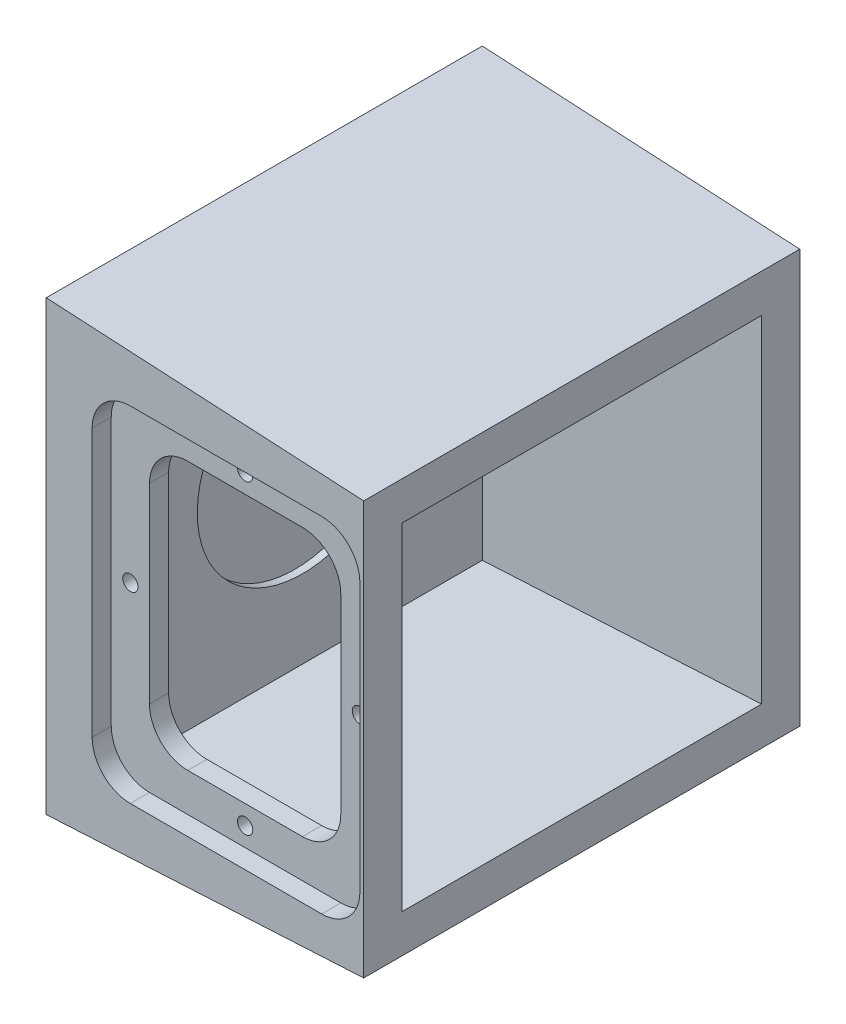
ISO-10303-21;
HEADER;
FILE_DESCRIPTION(('STEP AP214'),'2;1');
FILE_NAME('part.step','',(''),(''),'','','');
FILE_SCHEMA(('AUTOMOTIVE_DESIGN { 1 0 10303 214 1 1 1 1 }'));
ENDSEC;
DATA;
#1=APPLICATION_CONTEXT('core data for automotive mechanical design processes');
#2=APPLICATION_PROTOCOL_DEFINITION('international standard','automotive_design',2000,#1);
#3=PRODUCT_CONTEXT('',#1,'mechanical');
#4=PRODUCT('Part','Part','',(#3));
#5=PRODUCT_RELATED_PRODUCT_CATEGORY('part','',(#4));
#6=PRODUCT_DEFINITION_FORMATION('','',#4);
#7=PRODUCT_DEFINITION_CONTEXT('part definition',#1,'design');
#8=PRODUCT_DEFINITION('design','',#6,#7);
#9=PRODUCT_DEFINITION_SHAPE('','',#8);
#10=(LENGTH_UNIT() NAMED_UNIT(*) SI_UNIT(.MILLI.,.METRE.));
#11=(NAMED_UNIT(*) PLANE_ANGLE_UNIT() SI_UNIT($,.RADIAN.));
#12=(NAMED_UNIT(*) SI_UNIT($,.STERADIAN.) SOLID_ANGLE_UNIT());
#13=UNCERTAINTY_MEASURE_WITH_UNIT(LENGTH_MEASURE(1.E-05),#10,'distance_accuracy_value','');
#14=(GEOMETRIC_REPRESENTATION_CONTEXT(3) GLOBAL_UNCERTAINTY_ASSIGNED_CONTEXT((#13)) GLOBAL_UNIT_ASSIGNED_CONTEXT((#10,
#11,#12)) REPRESENTATION_CONTEXT('',''));
#15=CARTESIAN_POINT('',(0.,0.,0.));
#16=DIRECTION('',(0.,0.,1.));
#17=DIRECTION('',(1.,0.,0.));
#18=AXIS2_PLACEMENT_3D('',#15,#16,#17);
#19=CARTESIAN_POINT('',(-74.,0.,0.));
#20=DIRECTION('',(-1.,0.,0.));
#21=DIRECTION('',(0.,0.,1.));
#22=AXIS2_PLACEMENT_3D('',#19,#20,#21);
#23=PLANE('',#22);
#24=DIRECTION('',(0.,-1.,0.));
#25=VECTOR('',#24,1.);
#26=CARTESIAN_POINT('',(-74.,0.,-47.));
#27=LINE('',#26,#25);
#28=CARTESIAN_POINT('',(-74.,43.9917243836477,-47.));
#29=VERTEX_POINT('',#28);
#30=CARTESIAN_POINT('',(-74.,-43.9917243836477,-47.));
#31=VERTEX_POINT('',#30);
#32=EDGE_CURVE('E48',#29,#31,#27,.T.);
#33=ORIENTED_EDGE('',*,*,#32,.T.);
#34=DIRECTION('',(0.,0.,1.));
#35=VECTOR('',#34,1.);
#36=CARTESIAN_POINT('',(-74.,-43.9917243836477,57.));
#37=LINE('',#36,#35);
#38=CARTESIAN_POINT('',(-74.,-43.9917243836477,47.));
#39=VERTEX_POINT('',#38);
#40=EDGE_CURVE('E490',#31,#39,#37,.T.);
#41=ORIENTED_EDGE('',*,*,#40,.T.);
#42=DIRECTION('',(0.,-1.,0.));
#43=VECTOR('',#42,1.);
#44=CARTESIAN_POINT('',(-74.,0.,47.));
#45=LINE('',#44,#43);
#46=CARTESIAN_POINT('',(-74.,43.9917243836477,47.));
#47=VERTEX_POINT('',#46);
#48=EDGE_CURVE('E483',#47,#39,#45,.T.);
#49=ORIENTED_EDGE('',*,*,#48,.F.);
#50=DIRECTION('',(0.,0.,-1.));
#51=VECTOR('',#50,1.);
#52=CARTESIAN_POINT('',(-74.,43.9917243836477,57.));
#53=LINE('',#52,#51);
#54=EDGE_CURVE('E54',#47,#29,#53,.T.);
#55=ORIENTED_EDGE('',*,*,#54,.T.);
#56=EDGE_LOOP('',(#33,#41,#49,#55));
#57=FACE_BOUND('',#56,.T.);
#58=DIRECTION('',(0.,0.,-1.));
#59=VECTOR('',#58,1.);
#60=CARTESIAN_POINT('',(-74.,54.0063694267516,57.));
#61=LINE('',#60,#59);
#62=CARTESIAN_POINT('',(-74.,54.0063694267516,57.));
#63=VERTEX_POINT('',#62);
#64=CARTESIAN_POINT('',(-74.,54.0063694267516,-57.));
#65=VERTEX_POINT('',#64);
#66=EDGE_CURVE('E479',#63,#65,#61,.T.);
#67=ORIENTED_EDGE('',*,*,#66,.F.);
#68=DIRECTION('',(0.,-1.,0.));
#69=VECTOR('',#68,1.);
#70=CARTESIAN_POINT('',(-74.,0.,57.));
#71=LINE('',#70,#69);
#72=CARTESIAN_POINT('',(-74.,-54.0063694267516,57.));
#73=VERTEX_POINT('',#72);
#74=EDGE_CURVE('E11',#63,#73,#71,.T.);
#75=ORIENTED_EDGE('',*,*,#74,.T.);
#76=DIRECTION('',(0.,0.,1.));
#77=VECTOR('',#76,1.);
#78=CARTESIAN_POINT('',(-74.,-54.0063694267516,57.));
#79=LINE('',#78,#77);
#80=CARTESIAN_POINT('',(-74.,-54.0063694267516,-57.));
#81=VERTEX_POINT('',#80);
#82=EDGE_CURVE('E62',#81,#73,#79,.T.);
#83=ORIENTED_EDGE('',*,*,#82,.F.);
#84=DIRECTION('',(0.,-1.,0.));
#85=VECTOR('',#84,1.);
#86=CARTESIAN_POINT('',(-74.,0.,-57.));
#87=LINE('',#86,#85);
#88=EDGE_CURVE('E484',#65,#81,#87,.T.);
#89=ORIENTED_EDGE('',*,*,#88,.F.);
#90=EDGE_LOOP('',(#67,#75,#83,#89));
#91=FACE_BOUND('',#90,.T.);
#92=ADVANCED_FACE('F45',(#57,#91),#23,.F.);
#93=CARTESIAN_POINT('',(0.,0.,-57.));
#94=DIRECTION('',(0.,0.,1.));
#95=DIRECTION('',(1.,0.,0.));
#96=AXIS2_PLACEMENT_3D('',#93,#94,#95);
#97=PLANE('',#96);
#98=DIRECTION('',(-0.998537637326053,0.0540609548870792,0.));
#99=VECTOR('',#98,1.);
#100=CARTESIAN_POINT('',(-157.,58.5,-57.));
#101=LINE('',#100,#99);
#102=CARTESIAN_POINT('',(-157.,58.5,-57.));
#103=VERTEX_POINT('',#102);
#104=EDGE_CURVE('E395',#65,#103,#101,.T.);
#105=ORIENTED_EDGE('',*,*,#104,.F.);
#106=ORIENTED_EDGE('',*,*,#88,.T.);
#107=DIRECTION('',(0.998537637326054,0.0540609548870795,0.));
#108=VECTOR('',#107,1.);
#109=CARTESIAN_POINT('',(-157.,-58.5,-57.));
#110=LINE('',#109,#108);
#111=CARTESIAN_POINT('',(-157.,-58.5,-57.));
#112=VERTEX_POINT('',#111);
#113=EDGE_CURVE('E375',#112,#81,#110,.T.);
#114=ORIENTED_EDGE('',*,*,#113,.F.);
#115=DIRECTION('',(0.,-1.,0.));
#116=VECTOR('',#115,1.);
#117=CARTESIAN_POINT('',(-157.,-58.5,-57.));
#118=LINE('',#117,#116);
#119=EDGE_CURVE('E386',#103,#112,#118,.T.);
#120=ORIENTED_EDGE('',*,*,#119,.F.);
#121=EDGE_LOOP('',(#105,#106,#114,#120));
#122=FACE_BOUND('',#121,.T.);
#123=ADVANCED_FACE('F532',(#122),#97,.F.);
#124=CARTESIAN_POINT('',(0.,0.,-47.));
#125=DIRECTION('',(0.,0.,1.));
#126=DIRECTION('',(1.,0.,0.));
#127=AXIS2_PLACEMENT_3D('',#124,#125,#126);
#128=PLANE('',#127);
#129=ORIENTED_EDGE('',*,*,#32,.F.);
#130=DIRECTION('',(-0.998537637326054,0.0540609548870792,0.));
#131=VECTOR('',#130,1.);
#132=CARTESIAN_POINT('',(-157.540609548871,48.5146236267394,-47.));
#133=LINE('',#132,#131);
#134=CARTESIAN_POINT('',(-147.,47.9439536830108,-47.));
#135=VERTEX_POINT('',#134);
#136=EDGE_CURVE('E432',#29,#135,#133,.T.);
#137=ORIENTED_EDGE('',*,*,#136,.T.);
#138=DIRECTION('',(0.,-1.,0.));
#139=VECTOR('',#138,1.);
#140=CARTESIAN_POINT('',(-147.,-58.5,-47.));
#141=LINE('',#140,#139);
#142=CARTESIAN_POINT('',(-147.,-47.9439536830108,-47.));
#143=VERTEX_POINT('',#142);
#144=EDGE_CURVE('E429',#135,#143,#141,.T.);
#145=ORIENTED_EDGE('',*,*,#144,.T.);
#146=DIRECTION('',(0.998537637326053,0.0540609548870795,0.));
#147=VECTOR('',#146,1.);
#148=CARTESIAN_POINT('',(-157.540609548871,-48.5146236267395,-47.));
#149=LINE('',#148,#147);
#150=EDGE_CURVE('E435',#143,#31,#149,.T.);
#151=ORIENTED_EDGE('',*,*,#150,.T.);
#152=EDGE_LOOP('',(#129,#137,#145,#151));
#153=FACE_BOUND('',#152,.T.);
#154=ADVANCED_FACE('F502',(#153),#128,.T.);
#155=CARTESIAN_POINT('',(-157.540609548871,-48.5146236267395,57.));
#156=DIRECTION('',(-0.0540609548870795,0.998537637326053,0.));
#157=DIRECTION('',(-0.998537637326053,-0.0540609548870795,0.));
#158=AXIS2_PLACEMENT_3D('',#155,#156,#157);
#159=PLANE('',#158);
#160=ORIENTED_EDGE('',*,*,#40,.F.);
#161=ORIENTED_EDGE('',*,*,#150,.F.);
#162=DIRECTION('',(0.,0.,-1.));
#163=VECTOR('',#162,1.);
#164=CARTESIAN_POINT('',(-147.,-47.9439536830108,57.));
#165=LINE('',#164,#163);
#166=CARTESIAN_POINT('',(-147.,-47.9439536830108,47.));
#167=VERTEX_POINT('',#166);
#168=EDGE_CURVE('E380',#167,#143,#165,.T.);
#169=ORIENTED_EDGE('',*,*,#168,.F.);
#170=DIRECTION('',(0.998537637326053,0.0540609548870795,0.));
#171=VECTOR('',#170,1.);
#172=CARTESIAN_POINT('',(-157.540609548871,-48.5146236267395,47.));
#173=LINE('',#172,#171);
#174=EDGE_CURVE('E421',#167,#39,#173,.T.);
#175=ORIENTED_EDGE('',*,*,#174,.T.);
#176=EDGE_LOOP('',(#160,#161,#169,#175));
#177=FACE_BOUND('',#176,.T.);
#178=ADVANCED_FACE('F506',(#177),#159,.T.);
#179=CARTESIAN_POINT('',(-157.540609548871,48.5146236267394,57.));
#180=DIRECTION('',(-0.0540609548870792,-0.998537637326053,0.));
#181=DIRECTION('',(0.998537637326054,-0.0540609548870792,0.));
#182=AXIS2_PLACEMENT_3D('',#179,#180,#181);
#183=PLANE('',#182);
#184=ORIENTED_EDGE('',*,*,#54,.F.);
#185=DIRECTION('',(-0.998537637326054,0.0540609548870792,0.));
#186=VECTOR('',#185,1.);
#187=CARTESIAN_POINT('',(-157.540609548871,48.5146236267394,47.));
#188=LINE('',#187,#186);
#189=CARTESIAN_POINT('',(-147.,47.9439536830108,47.));
#190=VERTEX_POINT('',#189);
#191=EDGE_CURVE('E418',#47,#190,#188,.T.);
#192=ORIENTED_EDGE('',*,*,#191,.T.);
#193=DIRECTION('',(0.,0.,-1.));
#194=VECTOR('',#193,1.);
#195=CARTESIAN_POINT('',(-147.,47.9439536830108,57.));
#196=LINE('',#195,#194);
#197=EDGE_CURVE('E425',#190,#135,#196,.T.);
#198=ORIENTED_EDGE('',*,*,#197,.T.);
#199=ORIENTED_EDGE('',*,*,#136,.F.);
#200=EDGE_LOOP('',(#184,#192,#198,#199));
#201=FACE_BOUND('',#200,.T.);
#202=ADVANCED_FACE('F514',(#201),#183,.T.);
#203=CARTESIAN_POINT('',(-147.,-58.5,57.));
#204=DIRECTION('',(1.,0.,0.));
#205=DIRECTION('',(0.,1.,0.));
#206=AXIS2_PLACEMENT_3D('',#203,#204,#205);
#207=PLANE('',#206);
#208=CARTESIAN_POINT('',(-147.,0.,0.));
#209=DIRECTION('',(1.,0.,0.));
#210=DIRECTION('',(0.,1.,0.));
#211=AXIS2_PLACEMENT_3D('',#208,#209,#210);
#212=CIRCLE('',#211,27.5);
#213=CARTESIAN_POINT('',(-147.,27.5,0.));
#214=VERTEX_POINT('',#213);
#215=EDGE_CURVE('E411',#214,#214,#212,.F.);
#216=ORIENTED_EDGE('',*,*,#215,.T.);
#217=EDGE_LOOP('',(#216));
#218=FACE_BOUND('',#217,.T.);
#219=ORIENTED_EDGE('',*,*,#144,.F.);
#220=ORIENTED_EDGE('',*,*,#197,.F.);
#221=DIRECTION('',(0.,-1.,0.));
#222=VECTOR('',#221,1.);
#223=CARTESIAN_POINT('',(-147.,-58.5,47.));
#224=LINE('',#223,#222);
#225=EDGE_CURVE('E415',#190,#167,#224,.T.);
#226=ORIENTED_EDGE('',*,*,#225,.T.);
#227=ORIENTED_EDGE('',*,*,#168,.T.);
#228=EDGE_LOOP('',(#219,#220,#226,#227));
#229=FACE_BOUND('',#228,.T.);
#230=ADVANCED_FACE('F516',(#218,#229),#207,.T.);
#231=CARTESIAN_POINT('',(0.,0.,47.));
#232=DIRECTION('',(0.,0.,1.));
#233=DIRECTION('',(1.,0.,0.));
#234=AXIS2_PLACEMENT_3D('',#231,#232,#233);
#235=PLANE('',#234);
#236=CARTESIAN_POINT('',(-140.,0.,47.));
#237=DIRECTION('',(0.,0.,1.));
#238=DIRECTION('',(1.,0.,0.));
#239=AXIS2_PLACEMENT_3D('',#236,#237,#238);
#240=CIRCLE('',#239,2.);
#241=CARTESIAN_POINT('',(-138.,0.,47.));
#242=VERTEX_POINT('',#241);
#243=EDGE_CURVE('E269',#242,#242,#240,.T.);
#244=ORIENTED_EDGE('',*,*,#243,.T.);
#245=EDGE_LOOP('',(#244));
#246=FACE_BOUND('',#245,.T.);
#247=CARTESIAN_POINT('',(-110.,40.,47.));
#248=DIRECTION('',(0.,0.,1.));
#249=DIRECTION('',(1.,0.,0.));
#250=AXIS2_PLACEMENT_3D('',#247,#248,#249);
#251=CIRCLE('',#250,2.);
#252=CARTESIAN_POINT('',(-108.,40.,47.));
#253=VERTEX_POINT('',#252);
#254=EDGE_CURVE('E693',#253,#253,#251,.T.);
#255=ORIENTED_EDGE('',*,*,#254,.T.);
#256=EDGE_LOOP('',(#255));
#257=FACE_BOUND('',#256,.T.);
#258=CARTESIAN_POINT('',(-110.,-40.,47.));
#259=DIRECTION('',(0.,0.,1.));
#260=DIRECTION('',(-1.,0.,0.));
#261=AXIS2_PLACEMENT_3D('',#258,#259,#260);
#262=CIRCLE('',#261,2.);
#263=CARTESIAN_POINT('',(-112.,-40.,47.));
#264=VERTEX_POINT('',#263);
#265=EDGE_CURVE('E701',#264,#264,#262,.T.);
#266=ORIENTED_EDGE('',*,*,#265,.T.);
#267=EDGE_LOOP('',(#266));
#268=FACE_BOUND('',#267,.T.);
#269=CARTESIAN_POINT('',(-80.,0.,47.));
#270=DIRECTION('',(0.,0.,1.));
#271=DIRECTION('',(-1.,0.,0.));
#272=AXIS2_PLACEMENT_3D('',#269,#270,#271);
#273=CIRCLE('',#272,2.);
#274=CARTESIAN_POINT('',(-82.,0.,47.));
#275=VERTEX_POINT('',#274);
#276=EDGE_CURVE('E244',#275,#275,#273,.T.);
#277=ORIENTED_EDGE('',*,*,#276,.T.);
#278=EDGE_LOOP('',(#277));
#279=FACE_BOUND('',#278,.T.);
#280=DIRECTION('',(0.,-1.,0.));
#281=VECTOR('',#280,1.);
#282=CARTESIAN_POINT('',(-135.,0.,47.));
#283=LINE('',#282,#281);
#284=CARTESIAN_POINT('',(-135.,24.9999999999999,47.));
#285=VERTEX_POINT('',#284);
#286=CARTESIAN_POINT('',(-135.,-24.9999999999999,47.));
#287=VERTEX_POINT('',#286);
#288=EDGE_CURVE('E465',#285,#287,#283,.T.);
#289=ORIENTED_EDGE('',*,*,#288,.T.);
#290=CARTESIAN_POINT('',(-125.,-25.,47.));
#291=DIRECTION('',(0.,0.,1.));
#292=DIRECTION('',(1.,0.,0.));
#293=AXIS2_PLACEMENT_3D('',#290,#291,#292);
#294=CIRCLE('',#293,10.);
#295=CARTESIAN_POINT('',(-125.,-35.,47.));
#296=VERTEX_POINT('',#295);
#297=EDGE_CURVE('E469',#287,#296,#294,.T.);
#298=ORIENTED_EDGE('',*,*,#297,.T.);
#299=DIRECTION('',(1.,0.,0.));
#300=VECTOR('',#299,1.);
#301=CARTESIAN_POINT('',(0.,-35.,47.));
#302=LINE('',#301,#300);
#303=CARTESIAN_POINT('',(-95.0000000000001,-35.,47.));
#304=VERTEX_POINT('',#303);
#305=EDGE_CURVE('E410',#296,#304,#302,.T.);
#306=ORIENTED_EDGE('',*,*,#305,.T.);
#307=CARTESIAN_POINT('',(-95.,-25.,47.));
#308=DIRECTION('',(0.,0.,1.));
#309=DIRECTION('',(1.,0.,0.));
#310=AXIS2_PLACEMENT_3D('',#307,#308,#309);
#311=CIRCLE('',#310,10.);
#312=CARTESIAN_POINT('',(-85.,-25.,47.));
#313=VERTEX_POINT('',#312);
#314=EDGE_CURVE('E445',#304,#313,#311,.T.);
#315=ORIENTED_EDGE('',*,*,#314,.T.);
#316=DIRECTION('',(0.,1.,0.));
#317=VECTOR('',#316,1.);
#318=CARTESIAN_POINT('',(-85.,0.,47.));
#319=LINE('',#318,#317);
#320=CARTESIAN_POINT('',(-85.,24.9999999999999,47.));
#321=VERTEX_POINT('',#320);
#322=EDGE_CURVE('E449',#313,#321,#319,.T.);
#323=ORIENTED_EDGE('',*,*,#322,.T.);
#324=CARTESIAN_POINT('',(-95.,25.,47.));
#325=DIRECTION('',(0.,0.,1.));
#326=DIRECTION('',(1.,0.,0.));
#327=AXIS2_PLACEMENT_3D('',#324,#325,#326);
#328=CIRCLE('',#327,10.);
#329=CARTESIAN_POINT('',(-95.0000000000001,35.,47.));
#330=VERTEX_POINT('',#329);
#331=EDGE_CURVE('E453',#321,#330,#328,.T.);
#332=ORIENTED_EDGE('',*,*,#331,.T.);
#333=DIRECTION('',(-1.,0.,0.));
#334=VECTOR('',#333,1.);
#335=CARTESIAN_POINT('',(0.,35.,47.));
#336=LINE('',#335,#334);
#337=CARTESIAN_POINT('',(-125.,35.,47.));
#338=VERTEX_POINT('',#337);
#339=EDGE_CURVE('E457',#330,#338,#336,.T.);
#340=ORIENTED_EDGE('',*,*,#339,.T.);
#341=CARTESIAN_POINT('',(-125.,25.,47.));
#342=DIRECTION('',(0.,0.,1.));
#343=DIRECTION('',(1.,0.,0.));
#344=AXIS2_PLACEMENT_3D('',#341,#342,#343);
#345=CIRCLE('',#344,10.);
#346=EDGE_CURVE('E461',#338,#285,#345,.T.);
#347=ORIENTED_EDGE('',*,*,#346,.T.);
#348=EDGE_LOOP('',(#289,#298,#306,#315,#323,#332,#340,#347));
#349=FACE_BOUND('',#348,.T.);
#350=ORIENTED_EDGE('',*,*,#191,.F.);
#351=ORIENTED_EDGE('',*,*,#48,.T.);
#352=ORIENTED_EDGE('',*,*,#174,.F.);
#353=ORIENTED_EDGE('',*,*,#225,.F.);
#354=EDGE_LOOP('',(#350,#351,#352,#353));
#355=FACE_BOUND('',#354,.T.);
#356=ADVANCED_FACE('F511',(#246,#257,#268,#279,#349,#355),#235,.F.);
#357=CARTESIAN_POINT('',(-159.,0.,0.));
#358=DIRECTION('',(1.,0.,0.));
#359=DIRECTION('',(0.,0.,-1.));
#360=AXIS2_PLACEMENT_3D('',#357,#358,#359);
#361=CYLINDRICAL_SURFACE('',#360,27.5);
#362=CARTESIAN_POINT('',(-149.,0.,0.));
#363=DIRECTION('',(-1.,0.,0.));
#364=DIRECTION('',(0.,0.,1.));
#365=AXIS2_PLACEMENT_3D('',#362,#363,#364);
#366=CIRCLE('',#365,27.5);
#367=CARTESIAN_POINT('',(-149.,0.,27.5));
#368=VERTEX_POINT('',#367);
#369=EDGE_CURVE('E406',#368,#368,#366,.T.);
#370=ORIENTED_EDGE('',*,*,#369,.T.);
#371=EDGE_LOOP('',(#370));
#372=FACE_BOUND('',#371,.T.);
#373=ORIENTED_EDGE('',*,*,#215,.F.);
#374=EDGE_LOOP('',(#373));
#375=FACE_BOUND('',#374,.T.);
#376=ADVANCED_FACE('F526',(#372,#375),#361,.F.);
#377=CARTESIAN_POINT('',(-149.,0.,0.));
#378=DIRECTION('',(-1.,0.,0.));
#379=DIRECTION('',(0.,0.,1.));
#380=AXIS2_PLACEMENT_3D('',#377,#378,#379);
#381=PLANE('',#380);
#382=CARTESIAN_POINT('',(-149.,0.,0.));
#383=DIRECTION('',(-1.,0.,0.));
#384=DIRECTION('',(0.,0.,1.));
#385=AXIS2_PLACEMENT_3D('',#382,#383,#384);
#386=CIRCLE('',#385,6.);
#387=CARTESIAN_POINT('',(-149.,0.,6.));
#388=VERTEX_POINT('',#387);
#389=EDGE_CURVE('E669',#388,#388,#386,.T.);
#390=ORIENTED_EDGE('',*,*,#389,.T.);
#391=EDGE_LOOP('',(#390));
#392=FACE_BOUND('',#391,.T.);
#393=ORIENTED_EDGE('',*,*,#369,.F.);
#394=EDGE_LOOP('',(#393));
#395=FACE_BOUND('',#394,.T.);
#396=ADVANCED_FACE('F629',(#392,#395),#381,.F.);
#397=CARTESIAN_POINT('',(-125.,-25.,37.));
#398=DIRECTION('',(0.,0.,1.));
#399=DIRECTION('',(1.,0.,0.));
#400=AXIS2_PLACEMENT_3D('',#397,#398,#399);
#401=CYLINDRICAL_SURFACE('',#400,10.);
#402=DIRECTION('',(0.,0.,1.));
#403=VECTOR('',#402,1.);
#404=CARTESIAN_POINT('',(-135.,-24.9999999999999,37.));
#405=LINE('',#404,#403);
#406=CARTESIAN_POINT('',(-135.,-24.9999999999999,52.));
#407=VERTEX_POINT('',#406);
#408=EDGE_CURVE('E340',#287,#407,#405,.T.);
#409=ORIENTED_EDGE('',*,*,#408,.T.);
#410=CARTESIAN_POINT('',(-125.,-25.,52.));
#411=DIRECTION('',(0.,0.,-1.));
#412=DIRECTION('',(-1.,0.,0.));
#413=AXIS2_PLACEMENT_3D('',#410,#411,#412);
#414=CIRCLE('',#413,10.);
#415=CARTESIAN_POINT('',(-125.,-35.,52.));
#416=VERTEX_POINT('',#415);
#417=EDGE_CURVE('E335',#407,#416,#414,.F.);
#418=ORIENTED_EDGE('',*,*,#417,.T.);
#419=DIRECTION('',(0.,0.,1.));
#420=VECTOR('',#419,1.);
#421=CARTESIAN_POINT('',(-125.,-35.,37.));
#422=LINE('',#421,#420);
#423=EDGE_CURVE('E339',#296,#416,#422,.T.);
#424=ORIENTED_EDGE('',*,*,#423,.F.);
#425=ORIENTED_EDGE('',*,*,#297,.F.);
#426=EDGE_LOOP('',(#409,#418,#424,#425));
#427=FACE_BOUND('',#426,.T.);
#428=ADVANCED_FACE('F603',(#427),#401,.F.);
#429=CARTESIAN_POINT('',(-135.,-24.9999999999999,37.));
#430=DIRECTION('',(-1.,0.,0.));
#431=DIRECTION('',(0.,0.,1.));
#432=AXIS2_PLACEMENT_3D('',#429,#430,#431);
#433=PLANE('',#432);
#434=DIRECTION('',(0.,0.,1.));
#435=VECTOR('',#434,1.);
#436=CARTESIAN_POINT('',(-135.,24.9999999999999,37.));
#437=LINE('',#436,#435);
#438=CARTESIAN_POINT('',(-135.,25.,52.));
#439=VERTEX_POINT('',#438);
#440=EDGE_CURVE('E345',#285,#439,#437,.T.);
#441=ORIENTED_EDGE('',*,*,#440,.T.);
#442=DIRECTION('',(0.,-1.,0.));
#443=VECTOR('',#442,1.);
#444=CARTESIAN_POINT('',(-135.,-24.9999999999999,52.));
#445=LINE('',#444,#443);
#446=EDGE_CURVE('E331',#439,#407,#445,.T.);
#447=ORIENTED_EDGE('',*,*,#446,.T.);
#448=ORIENTED_EDGE('',*,*,#408,.F.);
#449=ORIENTED_EDGE('',*,*,#288,.F.);
#450=EDGE_LOOP('',(#441,#447,#448,#449));
#451=FACE_BOUND('',#450,.T.);
#452=ADVANCED_FACE('F599',(#451),#433,.F.);
#453=CARTESIAN_POINT('',(-125.,25.,37.));
#454=DIRECTION('',(0.,0.,1.));
#455=DIRECTION('',(1.,0.,0.));
#456=AXIS2_PLACEMENT_3D('',#453,#454,#455);
#457=CYLINDRICAL_SURFACE('',#456,10.);
#458=DIRECTION('',(0.,0.,1.));
#459=VECTOR('',#458,1.);
#460=CARTESIAN_POINT('',(-125.,35.,37.));
#461=LINE('',#460,#459);
#462=CARTESIAN_POINT('',(-125.,35.,52.));
#463=VERTEX_POINT('',#462);
#464=EDGE_CURVE('E349',#338,#463,#461,.T.);
#465=ORIENTED_EDGE('',*,*,#464,.T.);
#466=CARTESIAN_POINT('',(-125.,25.,52.));
#467=DIRECTION('',(0.,0.,-1.));
#468=DIRECTION('',(-1.,0.,0.));
#469=AXIS2_PLACEMENT_3D('',#466,#467,#468);
#470=CIRCLE('',#469,10.);
#471=EDGE_CURVE('E327',#463,#439,#470,.F.);
#472=ORIENTED_EDGE('',*,*,#471,.T.);
#473=ORIENTED_EDGE('',*,*,#440,.F.);
#474=ORIENTED_EDGE('',*,*,#346,.F.);
#475=EDGE_LOOP('',(#465,#472,#473,#474));
#476=FACE_BOUND('',#475,.T.);
#477=ADVANCED_FACE('F602',(#476),#457,.F.);
#478=CARTESIAN_POINT('',(-95.0000000000001,35.,37.));
#479=DIRECTION('',(0.,1.,0.));
#480=DIRECTION('',(-1.,0.,0.));
#481=AXIS2_PLACEMENT_3D('',#478,#479,#480);
#482=PLANE('',#481);
#483=DIRECTION('',(0.,0.,1.));
#484=VECTOR('',#483,1.);
#485=CARTESIAN_POINT('',(-95.0000000000001,35.,37.));
#486=LINE('',#485,#484);
#487=CARTESIAN_POINT('',(-95.0000000000001,35.,52.));
#488=VERTEX_POINT('',#487);
#489=EDGE_CURVE('E353',#330,#488,#486,.T.);
#490=ORIENTED_EDGE('',*,*,#489,.T.);
#491=DIRECTION('',(-1.,0.,0.));
#492=VECTOR('',#491,1.);
#493=CARTESIAN_POINT('',(-95.0000000000001,35.,52.));
#494=LINE('',#493,#492);
#495=EDGE_CURVE('E323',#488,#463,#494,.T.);
#496=ORIENTED_EDGE('',*,*,#495,.T.);
#497=ORIENTED_EDGE('',*,*,#464,.F.);
#498=ORIENTED_EDGE('',*,*,#339,.F.);
#499=EDGE_LOOP('',(#490,#496,#497,#498));
#500=FACE_BOUND('',#499,.T.);
#501=ADVANCED_FACE('F607',(#500),#482,.F.);
#502=CARTESIAN_POINT('',(-95.,25.,37.));
#503=DIRECTION('',(0.,0.,1.));
#504=DIRECTION('',(1.,0.,0.));
#505=AXIS2_PLACEMENT_3D('',#502,#503,#504);
#506=CYLINDRICAL_SURFACE('',#505,10.);
#507=DIRECTION('',(0.,0.,1.));
#508=VECTOR('',#507,1.);
#509=CARTESIAN_POINT('',(-85.,24.9999999999999,37.));
#510=LINE('',#509,#508);
#511=CARTESIAN_POINT('',(-85.,24.9999999999999,52.));
#512=VERTEX_POINT('',#511);
#513=EDGE_CURVE('E357',#321,#512,#510,.T.);
#514=ORIENTED_EDGE('',*,*,#513,.T.);
#515=CARTESIAN_POINT('',(-95.,25.,52.));
#516=DIRECTION('',(0.,0.,-1.));
#517=DIRECTION('',(-1.,0.,0.));
#518=AXIS2_PLACEMENT_3D('',#515,#516,#517);
#519=CIRCLE('',#518,10.);
#520=EDGE_CURVE('E319',#512,#488,#519,.F.);
#521=ORIENTED_EDGE('',*,*,#520,.T.);
#522=ORIENTED_EDGE('',*,*,#489,.F.);
#523=ORIENTED_EDGE('',*,*,#331,.F.);
#524=EDGE_LOOP('',(#514,#521,#522,#523));
#525=FACE_BOUND('',#524,.T.);
#526=ADVANCED_FACE('F611',(#525),#506,.F.);
#527=CARTESIAN_POINT('',(-85.,-24.9999999999999,37.));
#528=DIRECTION('',(1.,0.,0.));
#529=DIRECTION('',(0.,0.,-1.));
#530=AXIS2_PLACEMENT_3D('',#527,#528,#529);
#531=PLANE('',#530);
#532=DIRECTION('',(0.,0.,1.));
#533=VECTOR('',#532,1.);
#534=CARTESIAN_POINT('',(-85.,-25.,37.));
#535=LINE('',#534,#533);
#536=CARTESIAN_POINT('',(-85.,-25.,52.));
#537=VERTEX_POINT('',#536);
#538=EDGE_CURVE('E361',#313,#537,#535,.T.);
#539=ORIENTED_EDGE('',*,*,#538,.T.);
#540=DIRECTION('',(0.,1.,0.));
#541=VECTOR('',#540,1.);
#542=CARTESIAN_POINT('',(-85.,-24.9999999999999,52.));
#543=LINE('',#542,#541);
#544=EDGE_CURVE('E315',#537,#512,#543,.T.);
#545=ORIENTED_EDGE('',*,*,#544,.T.);
#546=ORIENTED_EDGE('',*,*,#513,.F.);
#547=ORIENTED_EDGE('',*,*,#322,.F.);
#548=EDGE_LOOP('',(#539,#545,#546,#547));
#549=FACE_BOUND('',#548,.T.);
#550=ADVANCED_FACE('F615',(#549),#531,.F.);
#551=CARTESIAN_POINT('',(-95.,-25.,37.));
#552=DIRECTION('',(0.,0.,1.));
#553=DIRECTION('',(1.,0.,0.));
#554=AXIS2_PLACEMENT_3D('',#551,#552,#553);
#555=CYLINDRICAL_SURFACE('',#554,10.);
#556=DIRECTION('',(0.,0.,1.));
#557=VECTOR('',#556,1.);
#558=CARTESIAN_POINT('',(-95.0000000000001,-35.,37.));
#559=LINE('',#558,#557);
#560=CARTESIAN_POINT('',(-95.0000000000001,-35.,52.));
#561=VERTEX_POINT('',#560);
#562=EDGE_CURVE('E365',#304,#561,#559,.T.);
#563=ORIENTED_EDGE('',*,*,#562,.T.);
#564=CARTESIAN_POINT('',(-95.,-25.,52.));
#565=DIRECTION('',(0.,0.,-1.));
#566=DIRECTION('',(-1.,0.,0.));
#567=AXIS2_PLACEMENT_3D('',#564,#565,#566);
#568=CIRCLE('',#567,10.);
#569=EDGE_CURVE('E294',#561,#537,#568,.F.);
#570=ORIENTED_EDGE('',*,*,#569,.T.);
#571=ORIENTED_EDGE('',*,*,#538,.F.);
#572=ORIENTED_EDGE('',*,*,#314,.F.);
#573=EDGE_LOOP('',(#563,#570,#571,#572));
#574=FACE_BOUND('',#573,.T.);
#575=ADVANCED_FACE('F619',(#574),#555,.F.);
#576=CARTESIAN_POINT('',(-95.0000000000001,-35.,37.));
#577=DIRECTION('',(0.,-1.,0.));
#578=DIRECTION('',(1.,0.,0.));
#579=AXIS2_PLACEMENT_3D('',#576,#577,#578);
#580=PLANE('',#579);
#581=ORIENTED_EDGE('',*,*,#423,.T.);
#582=DIRECTION('',(1.,0.,0.));
#583=VECTOR('',#582,1.);
#584=CARTESIAN_POINT('',(-95.0000000000001,-35.,52.));
#585=LINE('',#584,#583);
#586=EDGE_CURVE('E473',#416,#561,#585,.T.);
#587=ORIENTED_EDGE('',*,*,#586,.T.);
#588=ORIENTED_EDGE('',*,*,#562,.F.);
#589=ORIENTED_EDGE('',*,*,#305,.F.);
#590=EDGE_LOOP('',(#581,#587,#588,#589));
#591=FACE_BOUND('',#590,.T.);
#592=ADVANCED_FACE('F568',(#591),#580,.F.);
#593=CARTESIAN_POINT('',(-135.,-35.,52.));
#594=DIRECTION('',(0.,0.,-1.));
#595=DIRECTION('',(-1.,0.,0.));
#596=AXIS2_PLACEMENT_3D('',#593,#594,#595);
#597=PLANE('',#596);
#598=CARTESIAN_POINT('',(-140.,0.,52.));
#599=DIRECTION('',(0.,0.,1.));
#600=DIRECTION('',(1.,0.,0.));
#601=AXIS2_PLACEMENT_3D('',#598,#599,#600);
#602=CIRCLE('',#601,2.);
#603=CARTESIAN_POINT('',(-138.,0.,52.));
#604=VERTEX_POINT('',#603);
#605=EDGE_CURVE('E685',#604,#604,#602,.T.);
#606=ORIENTED_EDGE('',*,*,#605,.F.);
#607=EDGE_LOOP('',(#606));
#608=FACE_BOUND('',#607,.T.);
#609=CARTESIAN_POINT('',(-110.,40.,52.));
#610=DIRECTION('',(0.,0.,1.));
#611=DIRECTION('',(1.,0.,0.));
#612=AXIS2_PLACEMENT_3D('',#609,#610,#611);
#613=CIRCLE('',#612,2.);
#614=CARTESIAN_POINT('',(-108.,40.,52.));
#615=VERTEX_POINT('',#614);
#616=EDGE_CURVE('E689',#615,#615,#613,.T.);
#617=ORIENTED_EDGE('',*,*,#616,.F.);
#618=EDGE_LOOP('',(#617));
#619=FACE_BOUND('',#618,.T.);
#620=CARTESIAN_POINT('',(-110.,-40.,52.));
#621=DIRECTION('',(0.,0.,1.));
#622=DIRECTION('',(-1.,0.,0.));
#623=AXIS2_PLACEMENT_3D('',#620,#621,#622);
#624=CIRCLE('',#623,2.);
#625=CARTESIAN_POINT('',(-112.,-40.,52.));
#626=VERTEX_POINT('',#625);
#627=EDGE_CURVE('E697',#626,#626,#624,.T.);
#628=ORIENTED_EDGE('',*,*,#627,.F.);
#629=EDGE_LOOP('',(#628));
#630=FACE_BOUND('',#629,.T.);
#631=CARTESIAN_POINT('',(-80.,0.,52.));
#632=DIRECTION('',(0.,0.,1.));
#633=DIRECTION('',(-1.,0.,0.));
#634=AXIS2_PLACEMENT_3D('',#631,#632,#633);
#635=CIRCLE('',#634,2.);
#636=CARTESIAN_POINT('',(-82.,0.,52.));
#637=VERTEX_POINT('',#636);
#638=EDGE_CURVE('E679',#637,#637,#635,.T.);
#639=ORIENTED_EDGE('',*,*,#638,.F.);
#640=EDGE_LOOP('',(#639));
#641=FACE_BOUND('',#640,.T.);
#642=CARTESIAN_POINT('',(-135.,-35.,52.));
#643=DIRECTION('',(0.,0.,1.));
#644=DIRECTION('',(-1.,0.,0.));
#645=AXIS2_PLACEMENT_3D('',#642,#643,#644);
#646=CIRCLE('',#645,10.);
#647=CARTESIAN_POINT('',(-145.,-34.9999999999999,52.));
#648=VERTEX_POINT('',#647);
#649=CARTESIAN_POINT('',(-135.,-45.,52.));
#650=VERTEX_POINT('',#649);
#651=EDGE_CURVE('E212',#648,#650,#646,.T.);
#652=ORIENTED_EDGE('',*,*,#651,.T.);
#653=DIRECTION('',(1.,0.,0.));
#654=VECTOR('',#653,1.);
#655=CARTESIAN_POINT('',(-85.0000000000001,-45.,52.));
#656=LINE('',#655,#654);
#657=CARTESIAN_POINT('',(-85.0000000000001,-45.,52.));
#658=VERTEX_POINT('',#657);
#659=EDGE_CURVE('E224',#650,#658,#656,.T.);
#660=ORIENTED_EDGE('',*,*,#659,.T.);
#661=CARTESIAN_POINT('',(-85.,-35.,52.));
#662=DIRECTION('',(0.,0.,1.));
#663=DIRECTION('',(1.,0.,0.));
#664=AXIS2_PLACEMENT_3D('',#661,#662,#663);
#665=CIRCLE('',#664,10.);
#666=CARTESIAN_POINT('',(-75.,-35.,52.));
#667=VERTEX_POINT('',#666);
#668=EDGE_CURVE('E230',#658,#667,#665,.T.);
#669=ORIENTED_EDGE('',*,*,#668,.T.);
#670=DIRECTION('',(0.,1.,0.));
#671=VECTOR('',#670,1.);
#672=CARTESIAN_POINT('',(-75.,-34.9999999999999,52.));
#673=LINE('',#672,#671);
#674=CARTESIAN_POINT('',(-75.,34.9999999999999,52.));
#675=VERTEX_POINT('',#674);
#676=EDGE_CURVE('E249',#667,#675,#673,.T.);
#677=ORIENTED_EDGE('',*,*,#676,.T.);
#678=CARTESIAN_POINT('',(-85.,35.,52.));
#679=DIRECTION('',(0.,0.,1.));
#680=DIRECTION('',(1.,0.,0.));
#681=AXIS2_PLACEMENT_3D('',#678,#679,#680);
#682=CIRCLE('',#681,10.);
#683=CARTESIAN_POINT('',(-85.0000000000001,45.,52.));
#684=VERTEX_POINT('',#683);
#685=EDGE_CURVE('E253',#675,#684,#682,.T.);
#686=ORIENTED_EDGE('',*,*,#685,.T.);
#687=DIRECTION('',(-1.,0.,0.));
#688=VECTOR('',#687,1.);
#689=CARTESIAN_POINT('',(-85.0000000000001,45.,52.));
#690=LINE('',#689,#688);
#691=CARTESIAN_POINT('',(-135.,45.,52.));
#692=VERTEX_POINT('',#691);
#693=EDGE_CURVE('E257',#684,#692,#690,.T.);
#694=ORIENTED_EDGE('',*,*,#693,.T.);
#695=CARTESIAN_POINT('',(-135.,35.,52.));
#696=DIRECTION('',(0.,0.,1.));
#697=DIRECTION('',(1.,0.,0.));
#698=AXIS2_PLACEMENT_3D('',#695,#696,#697);
#699=CIRCLE('',#698,10.);
#700=CARTESIAN_POINT('',(-145.,34.9999999999999,52.));
#701=VERTEX_POINT('',#700);
#702=EDGE_CURVE('E261',#692,#701,#699,.T.);
#703=ORIENTED_EDGE('',*,*,#702,.T.);
#704=DIRECTION('',(0.,-1.,0.));
#705=VECTOR('',#704,1.);
#706=CARTESIAN_POINT('',(-145.,-34.9999999999999,52.));
#707=LINE('',#706,#705);
#708=EDGE_CURVE('E221',#701,#648,#707,.T.);
#709=ORIENTED_EDGE('',*,*,#708,.T.);
#710=EDGE_LOOP('',(#652,#660,#669,#677,#686,#694,#703,#709));
#711=FACE_BOUND('',#710,.T.);
#712=ORIENTED_EDGE('',*,*,#446,.F.);
#713=ORIENTED_EDGE('',*,*,#471,.F.);
#714=ORIENTED_EDGE('',*,*,#495,.F.);
#715=ORIENTED_EDGE('',*,*,#520,.F.);
#716=ORIENTED_EDGE('',*,*,#544,.F.);
#717=ORIENTED_EDGE('',*,*,#569,.F.);
#718=ORIENTED_EDGE('',*,*,#586,.F.);
#719=ORIENTED_EDGE('',*,*,#417,.F.);
#720=EDGE_LOOP('',(#712,#713,#714,#715,#716,#717,#718,#719));
#721=FACE_BOUND('',#720,.T.);
#722=ADVANCED_FACE('F232',(#608,#619,#630,#641,#711,#721),#597,.F.);
#723=CARTESIAN_POINT('',(-135.,-35.,52.));
#724=DIRECTION('',(0.,0.,1.));
#725=DIRECTION('',(1.,0.,0.));
#726=AXIS2_PLACEMENT_3D('',#723,#724,#725);
#727=CYLINDRICAL_SURFACE('',#726,10.);
#728=CARTESIAN_POINT('',(-135.,-35.,57.));
#729=DIRECTION('',(0.,0.,1.));
#730=DIRECTION('',(-1.,0.,0.));
#731=AXIS2_PLACEMENT_3D('',#728,#729,#730);
#732=CIRCLE('',#731,10.);
#733=CARTESIAN_POINT('',(-145.,-34.9999999999999,57.));
#734=VERTEX_POINT('',#733);
#735=CARTESIAN_POINT('',(-135.,-45.,57.));
#736=VERTEX_POINT('',#735);
#737=EDGE_CURVE('E215',#734,#736,#732,.T.);
#738=ORIENTED_EDGE('',*,*,#737,.T.);
#739=DIRECTION('',(0.,0.,1.));
#740=VECTOR('',#739,1.);
#741=CARTESIAN_POINT('',(-135.,-45.,52.));
#742=LINE('',#741,#740);
#743=EDGE_CURVE('E208',#650,#736,#742,.T.);
#744=ORIENTED_EDGE('',*,*,#743,.F.);
#745=ORIENTED_EDGE('',*,*,#651,.F.);
#746=DIRECTION('',(0.,0.,1.));
#747=VECTOR('',#746,1.);
#748=CARTESIAN_POINT('',(-145.,-34.9999999999999,52.));
#749=LINE('',#748,#747);
#750=EDGE_CURVE('E291',#648,#734,#749,.T.);
#751=ORIENTED_EDGE('',*,*,#750,.T.);
#752=EDGE_LOOP('',(#738,#744,#745,#751));
#753=FACE_BOUND('',#752,.T.);
#754=ADVANCED_FACE('F210',(#753),#727,.F.);
#755=CARTESIAN_POINT('',(-145.,-34.9999999999999,52.));
#756=DIRECTION('',(-1.,0.,0.));
#757=DIRECTION('',(0.,0.,1.));
#758=AXIS2_PLACEMENT_3D('',#755,#756,#757);
#759=PLANE('',#758);
#760=DIRECTION('',(0.,-1.,0.));
#761=VECTOR('',#760,1.);
#762=CARTESIAN_POINT('',(-145.,-34.9999999999999,57.));
#763=LINE('',#762,#761);
#764=CARTESIAN_POINT('',(-145.,34.9999999999999,57.));
#765=VERTEX_POINT('',#764);
#766=EDGE_CURVE('E237',#765,#734,#763,.T.);
#767=ORIENTED_EDGE('',*,*,#766,.T.);
#768=ORIENTED_EDGE('',*,*,#750,.F.);
#769=ORIENTED_EDGE('',*,*,#708,.F.);
#770=DIRECTION('',(0.,0.,1.));
#771=VECTOR('',#770,1.);
#772=CARTESIAN_POINT('',(-145.,34.9999999999999,52.));
#773=LINE('',#772,#771);
#774=EDGE_CURVE('E295',#701,#765,#773,.T.);
#775=ORIENTED_EDGE('',*,*,#774,.T.);
#776=EDGE_LOOP('',(#767,#768,#769,#775));
#777=FACE_BOUND('',#776,.T.);
#778=ADVANCED_FACE('F570',(#777),#759,.F.);
#779=CARTESIAN_POINT('',(-135.,35.,52.));
#780=DIRECTION('',(0.,0.,1.));
#781=DIRECTION('',(1.,0.,0.));
#782=AXIS2_PLACEMENT_3D('',#779,#780,#781);
#783=CYLINDRICAL_SURFACE('',#782,10.);
#784=CARTESIAN_POINT('',(-135.,35.,57.));
#785=DIRECTION('',(0.,0.,1.));
#786=DIRECTION('',(1.,0.,0.));
#787=AXIS2_PLACEMENT_3D('',#784,#785,#786);
#788=CIRCLE('',#787,10.);
#789=CARTESIAN_POINT('',(-135.,45.,57.));
#790=VERTEX_POINT('',#789);
#791=EDGE_CURVE('E241',#790,#765,#788,.T.);
#792=ORIENTED_EDGE('',*,*,#791,.T.);
#793=ORIENTED_EDGE('',*,*,#774,.F.);
#794=ORIENTED_EDGE('',*,*,#702,.F.);
#795=DIRECTION('',(0.,0.,1.));
#796=VECTOR('',#795,1.);
#797=CARTESIAN_POINT('',(-135.,45.,52.));
#798=LINE('',#797,#796);
#799=EDGE_CURVE('E298',#692,#790,#798,.T.);
#800=ORIENTED_EDGE('',*,*,#799,.T.);
#801=EDGE_LOOP('',(#792,#793,#794,#800));
#802=FACE_BOUND('',#801,.T.);
#803=ADVANCED_FACE('F573',(#802),#783,.F.);
#804=CARTESIAN_POINT('',(-85.0000000000001,45.,52.));
#805=DIRECTION('',(0.,1.,0.));
#806=DIRECTION('',(-1.,0.,0.));
#807=AXIS2_PLACEMENT_3D('',#804,#805,#806);
#808=PLANE('',#807);
#809=DIRECTION('',(-1.,0.,0.));
#810=VECTOR('',#809,1.);
#811=CARTESIAN_POINT('',(-85.0000000000001,45.,57.));
#812=LINE('',#811,#810);
#813=CARTESIAN_POINT('',(-85.0000000000001,45.,57.));
#814=VERTEX_POINT('',#813);
#815=EDGE_CURVE('E284',#814,#790,#812,.T.);
#816=ORIENTED_EDGE('',*,*,#815,.T.);
#817=ORIENTED_EDGE('',*,*,#799,.F.);
#818=ORIENTED_EDGE('',*,*,#693,.F.);
#819=DIRECTION('',(0.,0.,1.));
#820=VECTOR('',#819,1.);
#821=CARTESIAN_POINT('',(-85.0000000000001,45.,52.));
#822=LINE('',#821,#820);
#823=EDGE_CURVE('E301',#684,#814,#822,.T.);
#824=ORIENTED_EDGE('',*,*,#823,.T.);
#825=EDGE_LOOP('',(#816,#817,#818,#824));
#826=FACE_BOUND('',#825,.T.);
#827=ADVANCED_FACE('F577',(#826),#808,.F.);
#828=CARTESIAN_POINT('',(-85.,35.,52.));
#829=DIRECTION('',(0.,0.,1.));
#830=DIRECTION('',(1.,0.,0.));
#831=AXIS2_PLACEMENT_3D('',#828,#829,#830);
#832=CYLINDRICAL_SURFACE('',#831,10.);
#833=CARTESIAN_POINT('',(-85.,35.,57.));
#834=DIRECTION('',(0.,0.,1.));
#835=DIRECTION('',(1.,0.,0.));
#836=AXIS2_PLACEMENT_3D('',#833,#834,#835);
#837=CIRCLE('',#836,10.);
#838=CARTESIAN_POINT('',(-75.,34.9999999999999,57.));
#839=VERTEX_POINT('',#838);
#840=EDGE_CURVE('E280',#839,#814,#837,.T.);
#841=ORIENTED_EDGE('',*,*,#840,.T.);
#842=ORIENTED_EDGE('',*,*,#823,.F.);
#843=ORIENTED_EDGE('',*,*,#685,.F.);
#844=DIRECTION('',(0.,0.,1.));
#845=VECTOR('',#844,1.);
#846=CARTESIAN_POINT('',(-75.,34.9999999999999,52.));
#847=LINE('',#846,#845);
#848=EDGE_CURVE('E304',#675,#839,#847,.T.);
#849=ORIENTED_EDGE('',*,*,#848,.T.);
#850=EDGE_LOOP('',(#841,#842,#843,#849));
#851=FACE_BOUND('',#850,.T.);
#852=ADVANCED_FACE('F581',(#851),#832,.F.);
#853=CARTESIAN_POINT('',(-75.,-34.9999999999999,52.));
#854=DIRECTION('',(1.,0.,0.));
#855=DIRECTION('',(0.,0.,-1.));
#856=AXIS2_PLACEMENT_3D('',#853,#854,#855);
#857=PLANE('',#856);
#858=DIRECTION('',(0.,1.,0.));
#859=VECTOR('',#858,1.);
#860=CARTESIAN_POINT('',(-75.,-34.9999999999999,57.));
#861=LINE('',#860,#859);
#862=CARTESIAN_POINT('',(-75.,-35.,57.));
#863=VERTEX_POINT('',#862);
#864=EDGE_CURVE('E276',#863,#839,#861,.T.);
#865=ORIENTED_EDGE('',*,*,#864,.T.);
#866=ORIENTED_EDGE('',*,*,#848,.F.);
#867=ORIENTED_EDGE('',*,*,#676,.F.);
#868=DIRECTION('',(0.,0.,1.));
#869=VECTOR('',#868,1.);
#870=CARTESIAN_POINT('',(-75.,-35.,52.));
#871=LINE('',#870,#869);
#872=EDGE_CURVE('E307',#667,#863,#871,.T.);
#873=ORIENTED_EDGE('',*,*,#872,.T.);
#874=EDGE_LOOP('',(#865,#866,#867,#873));
#875=FACE_BOUND('',#874,.T.);
#876=ADVANCED_FACE('F585',(#875),#857,.F.);
#877=CARTESIAN_POINT('',(-85.,-35.,52.));
#878=DIRECTION('',(0.,0.,1.));
#879=DIRECTION('',(1.,0.,0.));
#880=AXIS2_PLACEMENT_3D('',#877,#878,#879);
#881=CYLINDRICAL_SURFACE('',#880,10.);
#882=CARTESIAN_POINT('',(-85.,-35.,57.));
#883=DIRECTION('',(0.,0.,1.));
#884=DIRECTION('',(1.,0.,0.));
#885=AXIS2_PLACEMENT_3D('',#882,#883,#884);
#886=CIRCLE('',#885,10.);
#887=CARTESIAN_POINT('',(-85.0000000000001,-45.,57.));
#888=VERTEX_POINT('',#887);
#889=EDGE_CURVE('E272',#888,#863,#886,.T.);
#890=ORIENTED_EDGE('',*,*,#889,.T.);
#891=ORIENTED_EDGE('',*,*,#872,.F.);
#892=ORIENTED_EDGE('',*,*,#668,.F.);
#893=DIRECTION('',(0.,0.,1.));
#894=VECTOR('',#893,1.);
#895=CARTESIAN_POINT('',(-85.0000000000001,-45.,52.));
#896=LINE('',#895,#894);
#897=EDGE_CURVE('E220',#658,#888,#896,.T.);
#898=ORIENTED_EDGE('',*,*,#897,.T.);
#899=EDGE_LOOP('',(#890,#891,#892,#898));
#900=FACE_BOUND('',#899,.T.);
#901=ADVANCED_FACE('F589',(#900),#881,.F.);
#902=CARTESIAN_POINT('',(-85.0000000000001,-45.,52.));
#903=DIRECTION('',(0.,-1.,0.));
#904=DIRECTION('',(1.,0.,0.));
#905=AXIS2_PLACEMENT_3D('',#902,#903,#904);
#906=PLANE('',#905);
#907=DIRECTION('',(1.,0.,0.));
#908=VECTOR('',#907,1.);
#909=CARTESIAN_POINT('',(-85.0000000000001,-45.,57.));
#910=LINE('',#909,#908);
#911=EDGE_CURVE('E268',#736,#888,#910,.T.);
#912=ORIENTED_EDGE('',*,*,#911,.T.);
#913=ORIENTED_EDGE('',*,*,#897,.F.);
#914=ORIENTED_EDGE('',*,*,#659,.F.);
#915=ORIENTED_EDGE('',*,*,#743,.T.);
#916=EDGE_LOOP('',(#912,#913,#914,#915));
#917=FACE_BOUND('',#916,.T.);
#918=ADVANCED_FACE('F225',(#917),#906,.F.);
#919=CARTESIAN_POINT('',(-159.,0.,0.));
#920=DIRECTION('',(-1.,0.,0.));
#921=DIRECTION('',(0.,0.,1.));
#922=AXIS2_PLACEMENT_3D('',#919,#920,#921);
#923=PLANE('',#922);
#924=CARTESIAN_POINT('',(-159.,0.,0.));
#925=DIRECTION('',(-1.,0.,0.));
#926=DIRECTION('',(0.,0.,1.));
#927=AXIS2_PLACEMENT_3D('',#924,#925,#926);
#928=CIRCLE('',#927,6.);
#929=CARTESIAN_POINT('',(-159.,0.,6.));
#930=VERTEX_POINT('',#929);
#931=EDGE_CURVE('E674',#930,#930,#928,.T.);
#932=ORIENTED_EDGE('',*,*,#931,.F.);
#933=EDGE_LOOP('',(#932));
#934=FACE_BOUND('',#933,.T.);
#935=CARTESIAN_POINT('',(-159.,0.,0.));
#936=DIRECTION('',(-1.,0.,0.));
#937=DIRECTION('',(0.,0.,1.));
#938=AXIS2_PLACEMENT_3D('',#935,#936,#937);
#939=CIRCLE('',#938,37.5);
#940=CARTESIAN_POINT('',(-159.,0.,37.5));
#941=VERTEX_POINT('',#940);
#942=EDGE_CURVE('E344',#941,#941,#939,.T.);
#943=ORIENTED_EDGE('',*,*,#942,.T.);
#944=EDGE_LOOP('',(#943));
#945=FACE_BOUND('',#944,.T.);
#946=ADVANCED_FACE('F596',(#934,#945),#923,.T.);
#947=CARTESIAN_POINT('',(-159.,0.,0.));
#948=DIRECTION('',(1.,0.,0.));
#949=DIRECTION('',(0.,0.,-1.));
#950=AXIS2_PLACEMENT_3D('',#947,#948,#949);
#951=CYLINDRICAL_SURFACE('',#950,37.5);
#952=ORIENTED_EDGE('',*,*,#942,.F.);
#953=EDGE_LOOP('',(#952));
#954=FACE_BOUND('',#953,.T.);
#955=CARTESIAN_POINT('',(-157.,0.,0.));
#956=DIRECTION('',(-1.,0.,0.));
#957=DIRECTION('',(0.,0.,1.));
#958=AXIS2_PLACEMENT_3D('',#955,#956,#957);
#959=CIRCLE('',#958,37.5);
#960=CARTESIAN_POINT('',(-157.,0.,37.5));
#961=VERTEX_POINT('',#960);
#962=EDGE_CURVE('E376',#961,#961,#959,.T.);
#963=ORIENTED_EDGE('',*,*,#962,.T.);
#964=EDGE_LOOP('',(#963));
#965=FACE_BOUND('',#964,.T.);
#966=ADVANCED_FACE('F633',(#954,#965),#951,.T.);
#967=CARTESIAN_POINT('',(-157.,-58.5,57.));
#968=DIRECTION('',(1.,0.,0.));
#969=DIRECTION('',(0.,1.,0.));
#970=AXIS2_PLACEMENT_3D('',#967,#968,#969);
#971=PLANE('',#970);
#972=ORIENTED_EDGE('',*,*,#962,.F.);
#973=EDGE_LOOP('',(#972));
#974=FACE_BOUND('',#973,.T.);
#975=ORIENTED_EDGE('',*,*,#119,.T.);
#976=DIRECTION('',(0.,0.,-1.));
#977=VECTOR('',#976,1.);
#978=CARTESIAN_POINT('',(-157.,-58.5,57.));
#979=LINE('',#978,#977);
#980=CARTESIAN_POINT('',(-157.,-58.5,57.));
#981=VERTEX_POINT('',#980);
#982=EDGE_CURVE('E392',#981,#112,#979,.T.);
#983=ORIENTED_EDGE('',*,*,#982,.F.);
#984=DIRECTION('',(0.,-1.,0.));
#985=VECTOR('',#984,1.);
#986=CARTESIAN_POINT('',(-157.,-58.5,57.));
#987=LINE('',#986,#985);
#988=CARTESIAN_POINT('',(-157.,58.5,57.));
#989=VERTEX_POINT('',#988);
#990=EDGE_CURVE('E389',#989,#981,#987,.T.);
#991=ORIENTED_EDGE('',*,*,#990,.F.);
#992=DIRECTION('',(0.,0.,-1.));
#993=VECTOR('',#992,1.);
#994=CARTESIAN_POINT('',(-157.,58.5,57.));
#995=LINE('',#994,#993);
#996=EDGE_CURVE('E381',#989,#103,#995,.T.);
#997=ORIENTED_EDGE('',*,*,#996,.T.);
#998=EDGE_LOOP('',(#975,#983,#991,#997));
#999=FACE_BOUND('',#998,.T.);
#1000=ADVANCED_FACE('F637',(#974,#999),#971,.F.);
#1001=CARTESIAN_POINT('',(-157.,58.5,57.));
#1002=DIRECTION('',(-0.0540609548870792,-0.998537637326053,0.));
#1003=DIRECTION('',(0.998537637326054,-0.0540609548870792,0.));
#1004=AXIS2_PLACEMENT_3D('',#1001,#1002,#1003);
#1005=PLANE('',#1004);
#1006=DIRECTION('',(-0.998537637326053,0.0540609548870792,0.));
#1007=VECTOR('',#1006,1.);
#1008=CARTESIAN_POINT('',(-157.,58.5,57.));
#1009=LINE('',#1008,#1007);
#1010=EDGE_CURVE('E385',#63,#989,#1009,.T.);
#1011=ORIENTED_EDGE('',*,*,#1010,.F.);
#1012=ORIENTED_EDGE('',*,*,#66,.T.);
#1013=ORIENTED_EDGE('',*,*,#104,.T.);
#1014=ORIENTED_EDGE('',*,*,#996,.F.);
#1015=EDGE_LOOP('',(#1011,#1012,#1013,#1014));
#1016=FACE_BOUND('',#1015,.T.);
#1017=ADVANCED_FACE('F644',(#1016),#1005,.F.);
#1018=CARTESIAN_POINT('',(-157.,-58.5,57.));
#1019=DIRECTION('',(-0.0540609548870795,0.998537637326053,0.));
#1020=DIRECTION('',(-0.998537637326053,-0.0540609548870795,0.));
#1021=AXIS2_PLACEMENT_3D('',#1018,#1019,#1020);
#1022=PLANE('',#1021);
#1023=ORIENTED_EDGE('',*,*,#113,.T.);
#1024=ORIENTED_EDGE('',*,*,#82,.T.);
#1025=DIRECTION('',(0.998537637326054,0.0540609548870795,0.));
#1026=VECTOR('',#1025,1.);
#1027=CARTESIAN_POINT('',(-157.,-58.5,57.));
#1028=LINE('',#1027,#1026);
#1029=EDGE_CURVE('E382',#981,#73,#1028,.T.);
#1030=ORIENTED_EDGE('',*,*,#1029,.F.);
#1031=ORIENTED_EDGE('',*,*,#982,.T.);
#1032=EDGE_LOOP('',(#1023,#1024,#1030,#1031));
#1033=FACE_BOUND('',#1032,.T.);
#1034=ADVANCED_FACE('F640',(#1033),#1022,.F.);
#1035=CARTESIAN_POINT('',(0.,0.,57.));
#1036=DIRECTION('',(0.,0.,1.));
#1037=DIRECTION('',(1.,0.,0.));
#1038=AXIS2_PLACEMENT_3D('',#1035,#1036,#1037);
#1039=PLANE('',#1038);
#1040=ORIENTED_EDGE('',*,*,#74,.F.);
#1041=ORIENTED_EDGE('',*,*,#1010,.T.);
#1042=ORIENTED_EDGE('',*,*,#990,.T.);
#1043=ORIENTED_EDGE('',*,*,#1029,.T.);
#1044=EDGE_LOOP('',(#1040,#1041,#1042,#1043));
#1045=FACE_BOUND('',#1044,.T.);
#1046=ORIENTED_EDGE('',*,*,#737,.F.);
#1047=ORIENTED_EDGE('',*,*,#766,.F.);
#1048=ORIENTED_EDGE('',*,*,#791,.F.);
#1049=ORIENTED_EDGE('',*,*,#815,.F.);
#1050=ORIENTED_EDGE('',*,*,#840,.F.);
#1051=ORIENTED_EDGE('',*,*,#864,.F.);
#1052=ORIENTED_EDGE('',*,*,#889,.F.);
#1053=ORIENTED_EDGE('',*,*,#911,.F.);
#1054=EDGE_LOOP('',(#1046,#1047,#1048,#1049,#1050,#1051,#1052,#1053));
#1055=FACE_BOUND('',#1054,.T.);
#1056=ADVANCED_FACE('F564',(#1045,#1055),#1039,.T.);
#1057=CARTESIAN_POINT('',(-80.,0.,47.));
#1058=DIRECTION('',(0.,0.,1.));
#1059=DIRECTION('',(1.,0.,0.));
#1060=AXIS2_PLACEMENT_3D('',#1057,#1058,#1059);
#1061=CYLINDRICAL_SURFACE('',#1060,2.);
#1062=ORIENTED_EDGE('',*,*,#276,.F.);
#1063=EDGE_LOOP('',(#1062));
#1064=FACE_BOUND('',#1063,.T.);
#1065=ORIENTED_EDGE('',*,*,#638,.T.);
#1066=EDGE_LOOP('',(#1065));
#1067=FACE_BOUND('',#1066,.T.);
#1068=ADVANCED_FACE('F560',(#1064,#1067),#1061,.F.);
#1069=CARTESIAN_POINT('',(-110.,-40.,47.));
#1070=DIRECTION('',(0.,0.,1.));
#1071=DIRECTION('',(1.,0.,0.));
#1072=AXIS2_PLACEMENT_3D('',#1069,#1070,#1071);
#1073=CYLINDRICAL_SURFACE('',#1072,2.);
#1074=ORIENTED_EDGE('',*,*,#265,.F.);
#1075=EDGE_LOOP('',(#1074));
#1076=FACE_BOUND('',#1075,.T.);
#1077=ORIENTED_EDGE('',*,*,#627,.T.);
#1078=EDGE_LOOP('',(#1077));
#1079=FACE_BOUND('',#1078,.T.);
#1080=ADVANCED_FACE('F556',(#1076,#1079),#1073,.F.);
#1081=CARTESIAN_POINT('',(-110.,40.,47.));
#1082=DIRECTION('',(0.,0.,1.));
#1083=DIRECTION('',(1.,0.,0.));
#1084=AXIS2_PLACEMENT_3D('',#1081,#1082,#1083);
#1085=CYLINDRICAL_SURFACE('',#1084,2.);
#1086=ORIENTED_EDGE('',*,*,#254,.F.);
#1087=EDGE_LOOP('',(#1086));
#1088=FACE_BOUND('',#1087,.T.);
#1089=ORIENTED_EDGE('',*,*,#616,.T.);
#1090=EDGE_LOOP('',(#1089));
#1091=FACE_BOUND('',#1090,.T.);
#1092=ADVANCED_FACE('F548',(#1088,#1091),#1085,.F.);
#1093=CARTESIAN_POINT('',(-140.,0.,47.));
#1094=DIRECTION('',(0.,0.,1.));
#1095=DIRECTION('',(1.,0.,0.));
#1096=AXIS2_PLACEMENT_3D('',#1093,#1094,#1095);
#1097=CYLINDRICAL_SURFACE('',#1096,2.);
#1098=ORIENTED_EDGE('',*,*,#243,.F.);
#1099=EDGE_LOOP('',(#1098));
#1100=FACE_BOUND('',#1099,.T.);
#1101=ORIENTED_EDGE('',*,*,#605,.T.);
#1102=EDGE_LOOP('',(#1101));
#1103=FACE_BOUND('',#1102,.T.);
#1104=ADVANCED_FACE('F541',(#1100,#1103),#1097,.F.);
#1105=CARTESIAN_POINT('',(-144.,0.,0.));
#1106=DIRECTION('',(-1.,0.,0.));
#1107=DIRECTION('',(0.,0.,1.));
#1108=AXIS2_PLACEMENT_3D('',#1105,#1106,#1107);
#1109=CYLINDRICAL_SURFACE('',#1108,6.);
#1110=ORIENTED_EDGE('',*,*,#931,.T.);
#1111=EDGE_LOOP('',(#1110));
#1112=FACE_BOUND('',#1111,.T.);
#1113=ORIENTED_EDGE('',*,*,#389,.F.);
#1114=EDGE_LOOP('',(#1113));
#1115=FACE_BOUND('',#1114,.T.);
#1116=ADVANCED_FACE('F533',(#1112,#1115),#1109,.F.);
#1117=CLOSED_SHELL('',(#92,#123,#154,#178,#202,#230,#356,#376,#396,#428,#452,#477,#501,#526,
#550,#575,#592,#722,#754,#778,#803,#827,#852,#876,#901,#918,#946,#966,#1000,#1017,#1034,#1056,
#1068,#1080,#1092,#1104,#1116));
#1118=MANIFOLD_SOLID_BREP('B2',#1117);
#1119=ADVANCED_BREP_SHAPE_REPRESENTATION('',(#18,#1118),#14);
#1120=SHAPE_DEFINITION_REPRESENTATION(#9,#1119);
ENDSEC;
END-ISO-10303-21;
